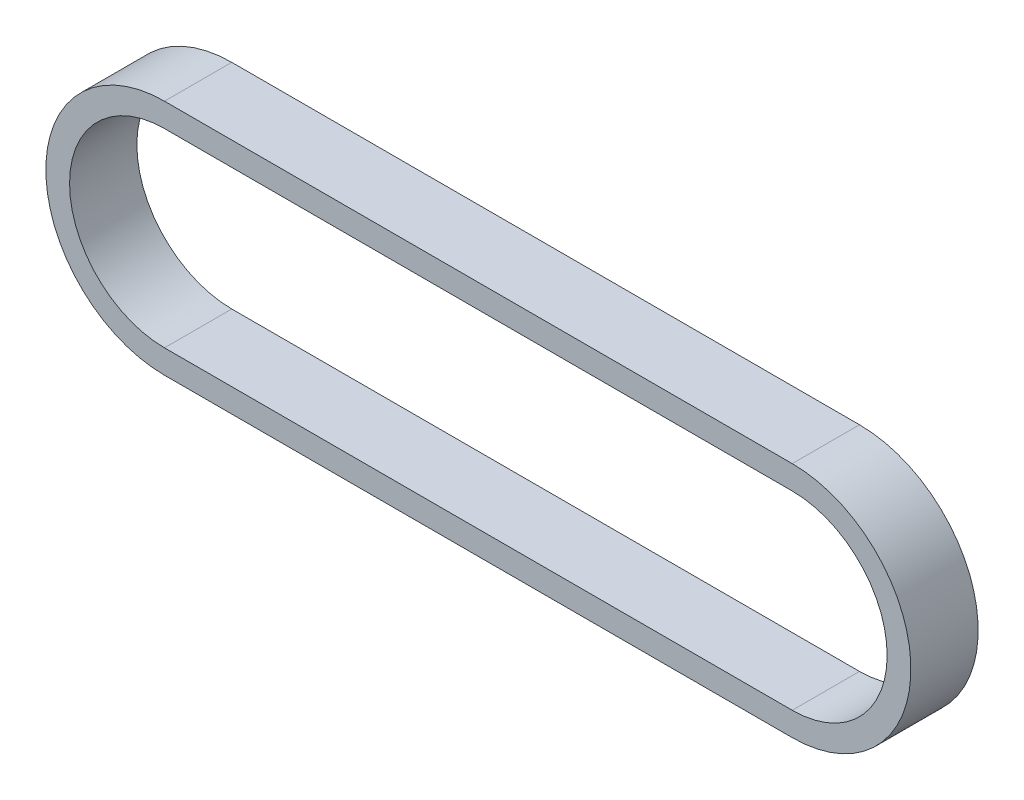
ISO-10303-21;
HEADER;
FILE_DESCRIPTION(('STEP AP214'),'2;1');
FILE_NAME('part.step','',(''),(''),'','','');
FILE_SCHEMA(('AUTOMOTIVE_DESIGN { 1 0 10303 214 1 1 1 1 }'));
ENDSEC;
DATA;
#1=APPLICATION_CONTEXT('core data for automotive mechanical design processes');
#2=APPLICATION_PROTOCOL_DEFINITION('international standard','automotive_design',2000,#1);
#3=PRODUCT_CONTEXT('',#1,'mechanical');
#4=PRODUCT('Part','Part','',(#3));
#5=PRODUCT_RELATED_PRODUCT_CATEGORY('part','',(#4));
#6=PRODUCT_DEFINITION_FORMATION('','',#4);
#7=PRODUCT_DEFINITION_CONTEXT('part definition',#1,'design');
#8=PRODUCT_DEFINITION('design','',#6,#7);
#9=PRODUCT_DEFINITION_SHAPE('','',#8);
#10=(LENGTH_UNIT() NAMED_UNIT(*) SI_UNIT(.MILLI.,.METRE.));
#11=(NAMED_UNIT(*) PLANE_ANGLE_UNIT() SI_UNIT($,.RADIAN.));
#12=(NAMED_UNIT(*) SI_UNIT($,.STERADIAN.) SOLID_ANGLE_UNIT());
#13=UNCERTAINTY_MEASURE_WITH_UNIT(LENGTH_MEASURE(1.E-05),#10,'distance_accuracy_value','');
#14=(GEOMETRIC_REPRESENTATION_CONTEXT(3) GLOBAL_UNCERTAINTY_ASSIGNED_CONTEXT((#13)) GLOBAL_UNIT_ASSIGNED_CONTEXT((#10,
#11,#12)) REPRESENTATION_CONTEXT('',''));
#15=CARTESIAN_POINT('',(0.,0.,0.));
#16=DIRECTION('',(0.,0.,1.));
#17=DIRECTION('',(1.,0.,0.));
#18=AXIS2_PLACEMENT_3D('',#15,#16,#17);
#19=CARTESIAN_POINT('',(0.,0.,9.));
#20=DIRECTION('',(0.,0.,1.));
#21=DIRECTION('',(1.,0.,0.));
#22=AXIS2_PLACEMENT_3D('',#19,#20,#21);
#23=PLANE('',#22);
#24=CARTESIAN_POINT('',(0.,0.,9.));
#25=DIRECTION('',(0.,0.,1.));
#26=DIRECTION('',(1.,0.,0.));
#27=AXIS2_PLACEMENT_3D('',#24,#25,#26);
#28=CIRCLE('',#27,15.875);
#29=CARTESIAN_POINT('',(0.,15.875,9.));
#30=VERTEX_POINT('',#29);
#31=CARTESIAN_POINT('',(0.,-15.875,9.));
#32=VERTEX_POINT('',#31);
#33=EDGE_CURVE('E140',#30,#32,#28,.T.);
#34=ORIENTED_EDGE('',*,*,#33,.T.);
#35=DIRECTION('',(1.,0.,0.));
#36=VECTOR('',#35,1.);
#37=CARTESIAN_POINT('',(0.,-15.875,9.));
#38=LINE('',#37,#36);
#39=CARTESIAN_POINT('',(83.975,-15.875,9.));
#40=VERTEX_POINT('',#39);
#41=EDGE_CURVE('E143',#32,#40,#38,.T.);
#42=ORIENTED_EDGE('',*,*,#41,.T.);
#43=CARTESIAN_POINT('',(83.975,0.,9.));
#44=DIRECTION('',(0.,0.,1.));
#45=DIRECTION('',(1.,0.,0.));
#46=AXIS2_PLACEMENT_3D('',#43,#44,#45);
#47=CIRCLE('',#46,15.875);
#48=CARTESIAN_POINT('',(83.975,15.875,9.));
#49=VERTEX_POINT('',#48);
#50=EDGE_CURVE('E146',#40,#49,#47,.T.);
#51=ORIENTED_EDGE('',*,*,#50,.T.);
#52=DIRECTION('',(-1.,0.,0.));
#53=VECTOR('',#52,1.);
#54=CARTESIAN_POINT('',(0.,15.875,9.));
#55=LINE('',#54,#53);
#56=EDGE_CURVE('E148',#49,#30,#55,.T.);
#57=ORIENTED_EDGE('',*,*,#56,.T.);
#58=EDGE_LOOP('',(#34,#42,#51,#57));
#59=FACE_BOUND('',#58,.T.);
#60=DIRECTION('',(1.,0.,0.));
#61=VECTOR('',#60,1.);
#62=CARTESIAN_POINT('',(0.,-12.7,9.));
#63=LINE('',#62,#61);
#64=CARTESIAN_POINT('',(0.,-12.7,9.));
#65=VERTEX_POINT('',#64);
#66=CARTESIAN_POINT('',(83.975,-12.7,9.));
#67=VERTEX_POINT('',#66);
#68=EDGE_CURVE('E112',#65,#67,#63,.T.);
#69=ORIENTED_EDGE('',*,*,#68,.F.);
#70=CARTESIAN_POINT('',(0.,0.,9.));
#71=DIRECTION('',(0.,0.,1.));
#72=DIRECTION('',(1.,0.,0.));
#73=AXIS2_PLACEMENT_3D('',#70,#71,#72);
#74=CIRCLE('',#73,12.7);
#75=CARTESIAN_POINT('',(0.,12.7,9.));
#76=VERTEX_POINT('',#75);
#77=EDGE_CURVE('E104',#76,#65,#74,.T.);
#78=ORIENTED_EDGE('',*,*,#77,.F.);
#79=DIRECTION('',(-1.,0.,0.));
#80=VECTOR('',#79,1.);
#81=CARTESIAN_POINT('',(0.,12.7,9.));
#82=LINE('',#81,#80);
#83=CARTESIAN_POINT('',(83.975,12.7,9.));
#84=VERTEX_POINT('',#83);
#85=EDGE_CURVE('E126',#84,#76,#82,.T.);
#86=ORIENTED_EDGE('',*,*,#85,.F.);
#87=CARTESIAN_POINT('',(83.975,0.,9.));
#88=DIRECTION('',(0.,0.,1.));
#89=DIRECTION('',(1.,0.,0.));
#90=AXIS2_PLACEMENT_3D('',#87,#88,#89);
#91=CIRCLE('',#90,12.7);
#92=EDGE_CURVE('E124',#67,#84,#91,.T.);
#93=ORIENTED_EDGE('',*,*,#92,.F.);
#94=EDGE_LOOP('',(#69,#78,#86,#93));
#95=FACE_BOUND('',#94,.T.);
#96=ADVANCED_FACE('F39',(#59,#95),#23,.T.);
#97=CARTESIAN_POINT('',(0.,0.,0.));
#98=DIRECTION('',(0.,0.,1.));
#99=DIRECTION('',(1.,0.,0.));
#100=AXIS2_PLACEMENT_3D('',#97,#98,#99);
#101=PLANE('',#100);
#102=CARTESIAN_POINT('',(0.,0.,0.));
#103=DIRECTION('',(0.,0.,1.));
#104=DIRECTION('',(1.,0.,0.));
#105=AXIS2_PLACEMENT_3D('',#102,#103,#104);
#106=CIRCLE('',#105,15.875);
#107=CARTESIAN_POINT('',(0.,15.875,0.));
#108=VERTEX_POINT('',#107);
#109=CARTESIAN_POINT('',(0.,-15.875,0.));
#110=VERTEX_POINT('',#109);
#111=EDGE_CURVE('E120',#108,#110,#106,.T.);
#112=ORIENTED_EDGE('',*,*,#111,.F.);
#113=DIRECTION('',(-1.,0.,0.));
#114=VECTOR('',#113,1.);
#115=CARTESIAN_POINT('',(0.,15.875,0.));
#116=LINE('',#115,#114);
#117=CARTESIAN_POINT('',(83.975,15.875,0.));
#118=VERTEX_POINT('',#117);
#119=EDGE_CURVE('E144',#118,#108,#116,.T.);
#120=ORIENTED_EDGE('',*,*,#119,.F.);
#121=CARTESIAN_POINT('',(83.975,0.,0.));
#122=DIRECTION('',(0.,0.,1.));
#123=DIRECTION('',(1.,0.,0.));
#124=AXIS2_PLACEMENT_3D('',#121,#122,#123);
#125=CIRCLE('',#124,15.875);
#126=CARTESIAN_POINT('',(83.975,-15.875,0.));
#127=VERTEX_POINT('',#126);
#128=EDGE_CURVE('E155',#127,#118,#125,.T.);
#129=ORIENTED_EDGE('',*,*,#128,.F.);
#130=DIRECTION('',(1.,0.,0.));
#131=VECTOR('',#130,1.);
#132=CARTESIAN_POINT('',(0.,-15.875,0.));
#133=LINE('',#132,#131);
#134=EDGE_CURVE('E153',#110,#127,#133,.T.);
#135=ORIENTED_EDGE('',*,*,#134,.F.);
#136=EDGE_LOOP('',(#112,#120,#129,#135));
#137=FACE_BOUND('',#136,.T.);
#138=CARTESIAN_POINT('',(0.,0.,0.));
#139=DIRECTION('',(0.,0.,1.));
#140=DIRECTION('',(1.,0.,0.));
#141=AXIS2_PLACEMENT_3D('',#138,#139,#140);
#142=CIRCLE('',#141,12.7);
#143=CARTESIAN_POINT('',(0.,12.7,0.));
#144=VERTEX_POINT('',#143);
#145=CARTESIAN_POINT('',(0.,-12.7,0.));
#146=VERTEX_POINT('',#145);
#147=EDGE_CURVE('E62',#144,#146,#142,.T.);
#148=ORIENTED_EDGE('',*,*,#147,.T.);
#149=DIRECTION('',(1.,0.,0.));
#150=VECTOR('',#149,1.);
#151=CARTESIAN_POINT('',(0.,-12.7,0.));
#152=LINE('',#151,#150);
#153=CARTESIAN_POINT('',(83.975,-12.7,0.));
#154=VERTEX_POINT('',#153);
#155=EDGE_CURVE('E119',#146,#154,#152,.T.);
#156=ORIENTED_EDGE('',*,*,#155,.T.);
#157=CARTESIAN_POINT('',(83.975,0.,0.));
#158=DIRECTION('',(0.,0.,1.));
#159=DIRECTION('',(1.,0.,0.));
#160=AXIS2_PLACEMENT_3D('',#157,#158,#159);
#161=CIRCLE('',#160,12.7);
#162=CARTESIAN_POINT('',(83.975,12.7,0.));
#163=VERTEX_POINT('',#162);
#164=EDGE_CURVE('E132',#154,#163,#161,.T.);
#165=ORIENTED_EDGE('',*,*,#164,.T.);
#166=DIRECTION('',(-1.,0.,0.));
#167=VECTOR('',#166,1.);
#168=CARTESIAN_POINT('',(0.,12.7,0.));
#169=LINE('',#168,#167);
#170=EDGE_CURVE('E113',#163,#144,#169,.T.);
#171=ORIENTED_EDGE('',*,*,#170,.T.);
#172=EDGE_LOOP('',(#148,#156,#165,#171));
#173=FACE_BOUND('',#172,.T.);
#174=ADVANCED_FACE('F173',(#137,#173),#101,.F.);
#175=CARTESIAN_POINT('',(0.,0.,9.));
#176=DIRECTION('',(0.,0.,-1.));
#177=DIRECTION('',(-1.,0.,0.));
#178=AXIS2_PLACEMENT_3D('',#175,#176,#177);
#179=CYLINDRICAL_SURFACE('',#178,15.875);
#180=ORIENTED_EDGE('',*,*,#111,.T.);
#181=DIRECTION('',(0.,0.,-1.));
#182=VECTOR('',#181,1.);
#183=CARTESIAN_POINT('',(0.,-15.875,9.));
#184=LINE('',#183,#182);
#185=EDGE_CURVE('E11',#32,#110,#184,.T.);
#186=ORIENTED_EDGE('',*,*,#185,.F.);
#187=ORIENTED_EDGE('',*,*,#33,.F.);
#188=DIRECTION('',(0.,0.,-1.));
#189=VECTOR('',#188,1.);
#190=CARTESIAN_POINT('',(0.,15.875,9.));
#191=LINE('',#190,#189);
#192=EDGE_CURVE('E150',#30,#108,#191,.T.);
#193=ORIENTED_EDGE('',*,*,#192,.T.);
#194=EDGE_LOOP('',(#180,#186,#187,#193));
#195=FACE_BOUND('',#194,.T.);
#196=ADVANCED_FACE('F41',(#195),#179,.T.);
#197=CARTESIAN_POINT('',(0.,-15.875,9.));
#198=DIRECTION('',(0.,1.,0.));
#199=DIRECTION('',(0.,0.,1.));
#200=AXIS2_PLACEMENT_3D('',#197,#198,#199);
#201=PLANE('',#200);
#202=ORIENTED_EDGE('',*,*,#134,.T.);
#203=DIRECTION('',(0.,0.,-1.));
#204=VECTOR('',#203,1.);
#205=CARTESIAN_POINT('',(83.975,-15.875,9.));
#206=LINE('',#205,#204);
#207=EDGE_CURVE('E47',#40,#127,#206,.T.);
#208=ORIENTED_EDGE('',*,*,#207,.F.);
#209=ORIENTED_EDGE('',*,*,#41,.F.);
#210=ORIENTED_EDGE('',*,*,#185,.T.);
#211=EDGE_LOOP('',(#202,#208,#209,#210));
#212=FACE_BOUND('',#211,.T.);
#213=ADVANCED_FACE('F183',(#212),#201,.F.);
#214=CARTESIAN_POINT('',(83.975,0.,9.));
#215=DIRECTION('',(0.,0.,-1.));
#216=DIRECTION('',(-1.,0.,0.));
#217=AXIS2_PLACEMENT_3D('',#214,#215,#216);
#218=CYLINDRICAL_SURFACE('',#217,15.875);
#219=ORIENTED_EDGE('',*,*,#128,.T.);
#220=DIRECTION('',(0.,0.,-1.));
#221=VECTOR('',#220,1.);
#222=CARTESIAN_POINT('',(83.975,15.875,9.));
#223=LINE('',#222,#221);
#224=EDGE_CURVE('E160',#49,#118,#223,.T.);
#225=ORIENTED_EDGE('',*,*,#224,.F.);
#226=ORIENTED_EDGE('',*,*,#50,.F.);
#227=ORIENTED_EDGE('',*,*,#207,.T.);
#228=EDGE_LOOP('',(#219,#225,#226,#227));
#229=FACE_BOUND('',#228,.T.);
#230=ADVANCED_FACE('F167',(#229),#218,.T.);
#231=CARTESIAN_POINT('',(0.,15.875,9.));
#232=DIRECTION('',(0.,-1.,0.));
#233=DIRECTION('',(0.,0.,-1.));
#234=AXIS2_PLACEMENT_3D('',#231,#232,#233);
#235=PLANE('',#234);
#236=ORIENTED_EDGE('',*,*,#119,.T.);
#237=ORIENTED_EDGE('',*,*,#192,.F.);
#238=ORIENTED_EDGE('',*,*,#56,.F.);
#239=ORIENTED_EDGE('',*,*,#224,.T.);
#240=EDGE_LOOP('',(#236,#237,#238,#239));
#241=FACE_BOUND('',#240,.T.);
#242=ADVANCED_FACE('F177',(#241),#235,.F.);
#243=CARTESIAN_POINT('',(0.,0.,9.));
#244=DIRECTION('',(0.,0.,-1.));
#245=DIRECTION('',(-1.,0.,0.));
#246=AXIS2_PLACEMENT_3D('',#243,#244,#245);
#247=CYLINDRICAL_SURFACE('',#246,12.7);
#248=ORIENTED_EDGE('',*,*,#147,.F.);
#249=DIRECTION('',(0.,0.,-1.));
#250=VECTOR('',#249,1.);
#251=CARTESIAN_POINT('',(0.,12.7,9.));
#252=LINE('',#251,#250);
#253=EDGE_CURVE('E108',#76,#144,#252,.T.);
#254=ORIENTED_EDGE('',*,*,#253,.F.);
#255=ORIENTED_EDGE('',*,*,#77,.T.);
#256=DIRECTION('',(0.,0.,-1.));
#257=VECTOR('',#256,1.);
#258=CARTESIAN_POINT('',(0.,-12.7,9.));
#259=LINE('',#258,#257);
#260=EDGE_CURVE('E107',#65,#146,#259,.T.);
#261=ORIENTED_EDGE('',*,*,#260,.T.);
#262=EDGE_LOOP('',(#248,#254,#255,#261));
#263=FACE_BOUND('',#262,.T.);
#264=ADVANCED_FACE('F106',(#263),#247,.F.);
#265=CARTESIAN_POINT('',(0.,-12.7,9.));
#266=DIRECTION('',(0.,1.,0.));
#267=DIRECTION('',(0.,0.,1.));
#268=AXIS2_PLACEMENT_3D('',#265,#266,#267);
#269=PLANE('',#268);
#270=ORIENTED_EDGE('',*,*,#155,.F.);
#271=ORIENTED_EDGE('',*,*,#260,.F.);
#272=ORIENTED_EDGE('',*,*,#68,.T.);
#273=DIRECTION('',(0.,0.,-1.));
#274=VECTOR('',#273,1.);
#275=CARTESIAN_POINT('',(83.975,-12.7,9.));
#276=LINE('',#275,#274);
#277=EDGE_CURVE('E121',#67,#154,#276,.T.);
#278=ORIENTED_EDGE('',*,*,#277,.T.);
#279=EDGE_LOOP('',(#270,#271,#272,#278));
#280=FACE_BOUND('',#279,.T.);
#281=ADVANCED_FACE('F116',(#280),#269,.T.);
#282=CARTESIAN_POINT('',(83.975,0.,9.));
#283=DIRECTION('',(0.,0.,-1.));
#284=DIRECTION('',(-1.,0.,0.));
#285=AXIS2_PLACEMENT_3D('',#282,#283,#284);
#286=CYLINDRICAL_SURFACE('',#285,12.7);
#287=ORIENTED_EDGE('',*,*,#164,.F.);
#288=ORIENTED_EDGE('',*,*,#277,.F.);
#289=ORIENTED_EDGE('',*,*,#92,.T.);
#290=DIRECTION('',(0.,0.,-1.));
#291=VECTOR('',#290,1.);
#292=CARTESIAN_POINT('',(83.975,12.7,9.));
#293=LINE('',#292,#291);
#294=EDGE_CURVE('E54',#84,#163,#293,.T.);
#295=ORIENTED_EDGE('',*,*,#294,.T.);
#296=EDGE_LOOP('',(#287,#288,#289,#295));
#297=FACE_BOUND('',#296,.T.);
#298=ADVANCED_FACE('F206',(#297),#286,.F.);
#299=CARTESIAN_POINT('',(0.,12.7,9.));
#300=DIRECTION('',(0.,-1.,0.));
#301=DIRECTION('',(0.,0.,-1.));
#302=AXIS2_PLACEMENT_3D('',#299,#300,#301);
#303=PLANE('',#302);
#304=ORIENTED_EDGE('',*,*,#170,.F.);
#305=ORIENTED_EDGE('',*,*,#294,.F.);
#306=ORIENTED_EDGE('',*,*,#85,.T.);
#307=ORIENTED_EDGE('',*,*,#253,.T.);
#308=EDGE_LOOP('',(#304,#305,#306,#307));
#309=FACE_BOUND('',#308,.T.);
#310=ADVANCED_FACE('F210',(#309),#303,.T.);
#311=CLOSED_SHELL('',(#96,#174,#196,#213,#230,#242,#264,#281,#298,#310));
#312=MANIFOLD_SOLID_BREP('B2',#311);
#313=ADVANCED_BREP_SHAPE_REPRESENTATION('',(#18,#312),#14);
#314=SHAPE_DEFINITION_REPRESENTATION(#9,#313);
ENDSEC;
END-ISO-10303-21;
